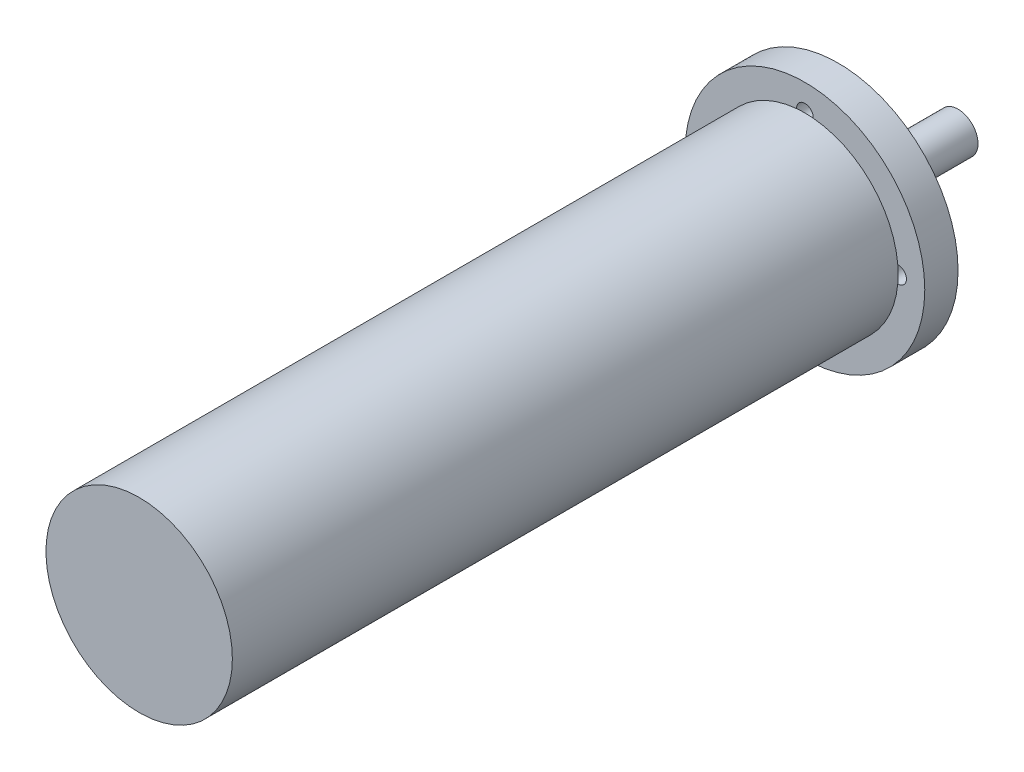
ISO-10303-21;
HEADER;
FILE_DESCRIPTION(('STEP AP214'),'2;1');
FILE_NAME('part.step','',(''),(''),'','','');
FILE_SCHEMA(('AUTOMOTIVE_DESIGN { 1 0 10303 214 1 1 1 1 }'));
ENDSEC;
DATA;
#1=APPLICATION_CONTEXT('core data for automotive mechanical design processes');
#2=APPLICATION_PROTOCOL_DEFINITION('international standard','automotive_design',2000,#1);
#3=PRODUCT_CONTEXT('',#1,'mechanical');
#4=PRODUCT('Part','Part','',(#3));
#5=PRODUCT_RELATED_PRODUCT_CATEGORY('part','',(#4));
#6=PRODUCT_DEFINITION_FORMATION('','',#4);
#7=PRODUCT_DEFINITION_CONTEXT('part definition',#1,'design');
#8=PRODUCT_DEFINITION('design','',#6,#7);
#9=PRODUCT_DEFINITION_SHAPE('','',#8);
#10=(LENGTH_UNIT() NAMED_UNIT(*) SI_UNIT(.MILLI.,.METRE.));
#11=(NAMED_UNIT(*) PLANE_ANGLE_UNIT() SI_UNIT($,.RADIAN.));
#12=(NAMED_UNIT(*) SI_UNIT($,.STERADIAN.) SOLID_ANGLE_UNIT());
#13=UNCERTAINTY_MEASURE_WITH_UNIT(LENGTH_MEASURE(1.E-05),#10,'distance_accuracy_value','');
#14=(GEOMETRIC_REPRESENTATION_CONTEXT(3) GLOBAL_UNCERTAINTY_ASSIGNED_CONTEXT((#13)) GLOBAL_UNIT_ASSIGNED_CONTEXT((#10,
#11,#12)) REPRESENTATION_CONTEXT('',''));
#15=CARTESIAN_POINT('',(0.,0.,0.));
#16=DIRECTION('',(0.,0.,1.));
#17=DIRECTION('',(1.,0.,0.));
#18=AXIS2_PLACEMENT_3D('',#15,#16,#17);
#19=CARTESIAN_POINT('',(0.,0.,-7.));
#20=DIRECTION('',(0.,0.,1.));
#21=DIRECTION('',(1.,0.,0.));
#22=AXIS2_PLACEMENT_3D('',#19,#20,#21);
#23=CYLINDRICAL_SURFACE('',#22,11.);
#24=CARTESIAN_POINT('',(0.,0.,-5.));
#25=DIRECTION('',(0.,0.,-1.));
#26=DIRECTION('',(-1.,0.,0.));
#27=AXIS2_PLACEMENT_3D('',#24,#25,#26);
#28=CIRCLE('',#27,11.);
#29=CARTESIAN_POINT('',(-11.,0.,-5.));
#30=VERTEX_POINT('',#29);
#31=EDGE_CURVE('E180',#30,#30,#28,.T.);
#32=ORIENTED_EDGE('',*,*,#31,.T.);
#33=EDGE_LOOP('',(#32));
#34=FACE_BOUND('',#33,.T.);
#35=CARTESIAN_POINT('',(0.,0.,-7.));
#36=DIRECTION('',(0.,0.,-1.));
#37=DIRECTION('',(-1.,0.,0.));
#38=AXIS2_PLACEMENT_3D('',#35,#36,#37);
#39=CIRCLE('',#38,11.);
#40=CARTESIAN_POINT('',(-11.,0.,-7.));
#41=VERTEX_POINT('',#40);
#42=EDGE_CURVE('E127',#41,#41,#39,.T.);
#43=ORIENTED_EDGE('',*,*,#42,.F.);
#44=EDGE_LOOP('',(#43));
#45=FACE_BOUND('',#44,.T.);
#46=ADVANCED_FACE('F47',(#34,#45),#23,.T.);
#47=CARTESIAN_POINT('',(0.,0.,-7.));
#48=DIRECTION('',(0.,0.,-1.));
#49=DIRECTION('',(-1.,0.,0.));
#50=AXIS2_PLACEMENT_3D('',#47,#48,#49);
#51=PLANE('',#50);
#52=CARTESIAN_POINT('',(0.,0.,-7.));
#53=DIRECTION('',(0.,0.,-1.));
#54=DIRECTION('',(-1.,0.,0.));
#55=AXIS2_PLACEMENT_3D('',#52,#53,#54);
#56=CIRCLE('',#55,3.);
#57=CARTESIAN_POINT('',(-3.,0.,-7.));
#58=VERTEX_POINT('',#57);
#59=EDGE_CURVE('E126',#58,#58,#56,.F.);
#60=ORIENTED_EDGE('',*,*,#59,.T.);
#61=EDGE_LOOP('',(#60));
#62=FACE_BOUND('',#61,.T.);
#63=ORIENTED_EDGE('',*,*,#42,.T.);
#64=EDGE_LOOP('',(#63));
#65=FACE_BOUND('',#64,.T.);
#66=ADVANCED_FACE('F205',(#62,#65),#51,.T.);
#67=CARTESIAN_POINT('',(0.,0.,-23.));
#68=DIRECTION('',(0.,0.,1.));
#69=DIRECTION('',(1.,0.,0.));
#70=AXIS2_PLACEMENT_3D('',#67,#68,#69);
#71=CYLINDRICAL_SURFACE('',#70,3.);
#72=ORIENTED_EDGE('',*,*,#59,.F.);
#73=EDGE_LOOP('',(#72));
#74=FACE_BOUND('',#73,.T.);
#75=CARTESIAN_POINT('',(0.,0.,-23.));
#76=DIRECTION('',(0.,0.,-1.));
#77=DIRECTION('',(-1.,0.,0.));
#78=AXIS2_PLACEMENT_3D('',#75,#76,#77);
#79=CIRCLE('',#78,3.);
#80=CARTESIAN_POINT('',(-3.,0.,-23.));
#81=VERTEX_POINT('',#80);
#82=EDGE_CURVE('E119',#81,#81,#79,.T.);
#83=ORIENTED_EDGE('',*,*,#82,.F.);
#84=EDGE_LOOP('',(#83));
#85=FACE_BOUND('',#84,.T.);
#86=ADVANCED_FACE('F210',(#74,#85),#71,.T.);
#87=CARTESIAN_POINT('',(0.,0.,-23.));
#88=DIRECTION('',(0.,0.,-1.));
#89=DIRECTION('',(-1.,0.,0.));
#90=AXIS2_PLACEMENT_3D('',#87,#88,#89);
#91=PLANE('',#90);
#92=ORIENTED_EDGE('',*,*,#82,.T.);
#93=EDGE_LOOP('',(#92));
#94=FACE_BOUND('',#93,.T.);
#95=ADVANCED_FACE('F234',(#94),#91,.T.);
#96=CARTESIAN_POINT('',(0.,0.,0.));
#97=DIRECTION('',(0.,0.,-1.));
#98=DIRECTION('',(-1.,0.,0.));
#99=AXIS2_PLACEMENT_3D('',#96,#97,#98);
#100=PLANE('',#99);
#101=CARTESIAN_POINT('',(0.,0.,0.));
#102=DIRECTION('',(0.,0.,-1.));
#103=DIRECTION('',(-1.,0.,0.));
#104=AXIS2_PLACEMENT_3D('',#101,#102,#103);
#105=CIRCLE('',#104,18.);
#106=CARTESIAN_POINT('',(-18.,0.,0.));
#107=VERTEX_POINT('',#106);
#108=EDGE_CURVE('E121',#107,#107,#105,.T.);
#109=ORIENTED_EDGE('',*,*,#108,.F.);
#110=EDGE_LOOP('',(#109));
#111=FACE_BOUND('',#110,.T.);
#112=CARTESIAN_POINT('',(0.,0.,0.));
#113=DIRECTION('',(0.,0.,-1.));
#114=DIRECTION('',(-1.,0.,0.));
#115=AXIS2_PLACEMENT_3D('',#112,#113,#114);
#116=CIRCLE('',#115,14.);
#117=CARTESIAN_POINT('',(-13.9441964285714,1.24875376332398,0.));
#118=VERTEX_POINT('',#117);
#119=CARTESIAN_POINT('',(-1.24875376332398,13.9441964285714,0.));
#120=VERTEX_POINT('',#119);
#121=EDGE_CURVE('E103',#118,#120,#116,.T.);
#122=ORIENTED_EDGE('',*,*,#121,.T.);
#123=CARTESIAN_POINT('',(0.,14.,0.));
#124=DIRECTION('',(0.,0.,-1.));
#125=DIRECTION('',(-1.,0.,0.));
#126=AXIS2_PLACEMENT_3D('',#123,#124,#125);
#127=CIRCLE('',#126,1.25);
#128=CARTESIAN_POINT('',(1.24875376332398,13.9441964285714,0.));
#129=VERTEX_POINT('',#128);
#130=EDGE_CURVE('E11',#120,#129,#127,.T.);
#131=ORIENTED_EDGE('',*,*,#130,.T.);
#132=CARTESIAN_POINT('',(13.9441964285714,1.24875376332398,0.));
#133=VERTEX_POINT('',#132);
#134=EDGE_CURVE('E104',#129,#133,#116,.T.);
#135=ORIENTED_EDGE('',*,*,#134,.T.);
#136=CARTESIAN_POINT('',(14.,0.,0.));
#137=DIRECTION('',(0.,0.,-1.));
#138=DIRECTION('',(-1.,0.,0.));
#139=AXIS2_PLACEMENT_3D('',#136,#137,#138);
#140=CIRCLE('',#139,1.25);
#141=CARTESIAN_POINT('',(13.9441964285714,-1.24875376332398,0.));
#142=VERTEX_POINT('',#141);
#143=EDGE_CURVE('E135',#133,#142,#140,.T.);
#144=ORIENTED_EDGE('',*,*,#143,.T.);
#145=CARTESIAN_POINT('',(1.24875376332398,-13.9441964285714,0.));
#146=VERTEX_POINT('',#145);
#147=EDGE_CURVE('E120',#142,#146,#116,.T.);
#148=ORIENTED_EDGE('',*,*,#147,.T.);
#149=CARTESIAN_POINT('',(0.,-14.,0.));
#150=DIRECTION('',(0.,0.,-1.));
#151=DIRECTION('',(-1.,0.,0.));
#152=AXIS2_PLACEMENT_3D('',#149,#150,#151);
#153=CIRCLE('',#152,1.25);
#154=CARTESIAN_POINT('',(-1.24875376332398,-13.9441964285714,0.));
#155=VERTEX_POINT('',#154);
#156=EDGE_CURVE('E142',#146,#155,#153,.T.);
#157=ORIENTED_EDGE('',*,*,#156,.T.);
#158=CARTESIAN_POINT('',(-13.9441964285714,-1.24875376332398,0.));
#159=VERTEX_POINT('',#158);
#160=EDGE_CURVE('E113',#155,#159,#116,.T.);
#161=ORIENTED_EDGE('',*,*,#160,.T.);
#162=CARTESIAN_POINT('',(-14.,0.,0.));
#163=DIRECTION('',(0.,0.,-1.));
#164=DIRECTION('',(-1.,0.,0.));
#165=AXIS2_PLACEMENT_3D('',#162,#163,#164);
#166=CIRCLE('',#165,1.25);
#167=EDGE_CURVE('E56',#159,#118,#166,.T.);
#168=ORIENTED_EDGE('',*,*,#167,.T.);
#169=EDGE_LOOP('',(#122,#131,#135,#144,#148,#157,#161,#168));
#170=FACE_BOUND('',#169,.T.);
#171=ADVANCED_FACE('F108',(#111,#170),#100,.F.);
#172=CARTESIAN_POINT('',(0.,0.,-5.));
#173=DIRECTION('',(0.,0.,1.));
#174=DIRECTION('',(1.,0.,0.));
#175=AXIS2_PLACEMENT_3D('',#172,#173,#174);
#176=CYLINDRICAL_SURFACE('',#175,18.);
#177=CARTESIAN_POINT('',(0.,0.,-5.));
#178=DIRECTION('',(0.,0.,-1.));
#179=DIRECTION('',(-1.,0.,0.));
#180=AXIS2_PLACEMENT_3D('',#177,#178,#179);
#181=CIRCLE('',#180,18.);
#182=CARTESIAN_POINT('',(-18.,0.,-5.));
#183=VERTEX_POINT('',#182);
#184=EDGE_CURVE('E177',#183,#183,#181,.T.);
#185=ORIENTED_EDGE('',*,*,#184,.F.);
#186=EDGE_LOOP('',(#185));
#187=FACE_BOUND('',#186,.T.);
#188=ORIENTED_EDGE('',*,*,#108,.T.);
#189=EDGE_LOOP('',(#188));
#190=FACE_BOUND('',#189,.T.);
#191=ADVANCED_FACE('F221',(#187,#190),#176,.T.);
#192=CARTESIAN_POINT('',(0.,0.,-5.));
#193=DIRECTION('',(0.,0.,-1.));
#194=DIRECTION('',(-1.,0.,0.));
#195=AXIS2_PLACEMENT_3D('',#192,#193,#194);
#196=PLANE('',#195);
#197=CARTESIAN_POINT('',(0.,14.,-5.));
#198=DIRECTION('',(0.,0.,-1.));
#199=DIRECTION('',(-1.,0.,0.));
#200=AXIS2_PLACEMENT_3D('',#197,#198,#199);
#201=CIRCLE('',#200,1.25);
#202=CARTESIAN_POINT('',(-1.25,14.,-5.));
#203=VERTEX_POINT('',#202);
#204=EDGE_CURVE('E97',#203,#203,#201,.T.);
#205=ORIENTED_EDGE('',*,*,#204,.F.);
#206=EDGE_LOOP('',(#205));
#207=FACE_BOUND('',#206,.T.);
#208=CARTESIAN_POINT('',(-14.,0.,-5.));
#209=DIRECTION('',(0.,0.,-1.));
#210=DIRECTION('',(-1.,0.,0.));
#211=AXIS2_PLACEMENT_3D('',#208,#209,#210);
#212=CIRCLE('',#211,1.25);
#213=CARTESIAN_POINT('',(-15.25,0.,-5.));
#214=VERTEX_POINT('',#213);
#215=EDGE_CURVE('E96',#214,#214,#212,.T.);
#216=ORIENTED_EDGE('',*,*,#215,.F.);
#217=EDGE_LOOP('',(#216));
#218=FACE_BOUND('',#217,.T.);
#219=CARTESIAN_POINT('',(0.,-14.,-5.));
#220=DIRECTION('',(0.,0.,-1.));
#221=DIRECTION('',(-1.,0.,0.));
#222=AXIS2_PLACEMENT_3D('',#219,#220,#221);
#223=CIRCLE('',#222,1.25);
#224=CARTESIAN_POINT('',(-1.25,-14.,-5.));
#225=VERTEX_POINT('',#224);
#226=EDGE_CURVE('E158',#225,#225,#223,.T.);
#227=ORIENTED_EDGE('',*,*,#226,.F.);
#228=EDGE_LOOP('',(#227));
#229=FACE_BOUND('',#228,.T.);
#230=CARTESIAN_POINT('',(14.,0.,-5.));
#231=DIRECTION('',(0.,0.,-1.));
#232=DIRECTION('',(-1.,0.,0.));
#233=AXIS2_PLACEMENT_3D('',#230,#231,#232);
#234=CIRCLE('',#233,1.25);
#235=CARTESIAN_POINT('',(12.75,0.,-5.));
#236=VERTEX_POINT('',#235);
#237=EDGE_CURVE('E170',#236,#236,#234,.T.);
#238=ORIENTED_EDGE('',*,*,#237,.F.);
#239=EDGE_LOOP('',(#238));
#240=FACE_BOUND('',#239,.T.);
#241=ORIENTED_EDGE('',*,*,#184,.T.);
#242=EDGE_LOOP('',(#241));
#243=FACE_BOUND('',#242,.T.);
#244=ORIENTED_EDGE('',*,*,#31,.F.);
#245=EDGE_LOOP('',(#244));
#246=FACE_BOUND('',#245,.T.);
#247=ADVANCED_FACE('F216',(#207,#218,#229,#240,#243,#246),#196,.T.);
#248=CARTESIAN_POINT('',(0.,0.,100.));
#249=DIRECTION('',(0.,0.,1.));
#250=DIRECTION('',(1.,0.,0.));
#251=AXIS2_PLACEMENT_3D('',#248,#249,#250);
#252=PLANE('',#251);
#253=CARTESIAN_POINT('',(0.,0.,100.));
#254=DIRECTION('',(0.,0.,1.));
#255=DIRECTION('',(1.,0.,0.));
#256=AXIS2_PLACEMENT_3D('',#253,#254,#255);
#257=CIRCLE('',#256,14.);
#258=CARTESIAN_POINT('',(14.,0.,100.));
#259=VERTEX_POINT('',#258);
#260=EDGE_CURVE('E131',#259,#259,#257,.T.);
#261=ORIENTED_EDGE('',*,*,#260,.T.);
#262=EDGE_LOOP('',(#261));
#263=FACE_BOUND('',#262,.T.);
#264=ADVANCED_FACE('F201',(#263),#252,.T.);
#265=CARTESIAN_POINT('',(0.,0.,100.));
#266=DIRECTION('',(0.,0.,-1.));
#267=DIRECTION('',(-1.,0.,0.));
#268=AXIS2_PLACEMENT_3D('',#265,#266,#267);
#269=CYLINDRICAL_SURFACE('',#268,14.);
#270=ORIENTED_EDGE('',*,*,#260,.F.);
#271=EDGE_LOOP('',(#270));
#272=FACE_BOUND('',#271,.T.);
#273=EDGE_CURVE('E114',#133,#142,#116,.T.);
#274=ORIENTED_EDGE('',*,*,#273,.F.);
#275=ORIENTED_EDGE('',*,*,#134,.F.);
#276=EDGE_CURVE('E94',#120,#129,#116,.T.);
#277=ORIENTED_EDGE('',*,*,#276,.F.);
#278=ORIENTED_EDGE('',*,*,#121,.F.);
#279=EDGE_CURVE('E111',#159,#118,#116,.T.);
#280=ORIENTED_EDGE('',*,*,#279,.F.);
#281=ORIENTED_EDGE('',*,*,#160,.F.);
#282=EDGE_CURVE('E149',#146,#155,#116,.T.);
#283=ORIENTED_EDGE('',*,*,#282,.F.);
#284=ORIENTED_EDGE('',*,*,#147,.F.);
#285=EDGE_LOOP('',(#274,#275,#277,#278,#280,#281,#283,#284));
#286=FACE_BOUND('',#285,.T.);
#287=ADVANCED_FACE('F49',(#272,#286),#269,.T.);
#288=CARTESIAN_POINT('',(0.,0.,0.));
#289=DIRECTION('',(0.,0.,-1.));
#290=DIRECTION('',(-1.,0.,0.));
#291=AXIS2_PLACEMENT_3D('',#288,#289,#290);
#292=PLANE('',#291);
#293=ORIENTED_EDGE('',*,*,#273,.T.);
#294=CARTESIAN_POINT('',(14.,0.,0.));
#295=DIRECTION('',(0.,0.,-1.));
#296=DIRECTION('',(-1.,0.,0.));
#297=AXIS2_PLACEMENT_3D('',#294,#295,#296);
#298=CIRCLE('',#297,1.25);
#299=EDGE_CURVE('E174',#133,#142,#298,.F.);
#300=ORIENTED_EDGE('',*,*,#299,.F.);
#301=EDGE_LOOP('',(#293,#300));
#302=FACE_BOUND('',#301,.T.);
#303=ADVANCED_FACE('F192',(#302),#292,.T.);
#304=CARTESIAN_POINT('',(14.,0.,-5.));
#305=DIRECTION('',(0.,0.,-1.));
#306=DIRECTION('',(-1.,0.,0.));
#307=AXIS2_PLACEMENT_3D('',#304,#305,#306);
#308=CYLINDRICAL_SURFACE('',#307,1.25);
#309=ORIENTED_EDGE('',*,*,#299,.T.);
#310=ORIENTED_EDGE('',*,*,#143,.F.);
#311=EDGE_LOOP('',(#309,#310));
#312=FACE_BOUND('',#311,.T.);
#313=ORIENTED_EDGE('',*,*,#237,.T.);
#314=EDGE_LOOP('',(#313));
#315=FACE_BOUND('',#314,.T.);
#316=ADVANCED_FACE('F189',(#312,#315),#308,.F.);
#317=CARTESIAN_POINT('',(0.,0.,0.));
#318=DIRECTION('',(0.,0.,-1.));
#319=DIRECTION('',(-1.,0.,0.));
#320=AXIS2_PLACEMENT_3D('',#317,#318,#319);
#321=PLANE('',#320);
#322=ORIENTED_EDGE('',*,*,#282,.T.);
#323=CARTESIAN_POINT('',(0.,-14.,0.));
#324=DIRECTION('',(0.,0.,-1.));
#325=DIRECTION('',(-1.,0.,0.));
#326=AXIS2_PLACEMENT_3D('',#323,#324,#325);
#327=CIRCLE('',#326,1.25);
#328=EDGE_CURVE('E163',#146,#155,#327,.F.);
#329=ORIENTED_EDGE('',*,*,#328,.F.);
#330=EDGE_LOOP('',(#322,#329));
#331=FACE_BOUND('',#330,.T.);
#332=ADVANCED_FACE('F199',(#331),#321,.T.);
#333=CARTESIAN_POINT('',(0.,-14.,-5.));
#334=DIRECTION('',(0.,0.,-1.));
#335=DIRECTION('',(-1.,0.,0.));
#336=AXIS2_PLACEMENT_3D('',#333,#334,#335);
#337=CYLINDRICAL_SURFACE('',#336,1.25);
#338=ORIENTED_EDGE('',*,*,#328,.T.);
#339=ORIENTED_EDGE('',*,*,#156,.F.);
#340=EDGE_LOOP('',(#338,#339));
#341=FACE_BOUND('',#340,.T.);
#342=ORIENTED_EDGE('',*,*,#226,.T.);
#343=EDGE_LOOP('',(#342));
#344=FACE_BOUND('',#343,.T.);
#345=ADVANCED_FACE('F322',(#341,#344),#337,.F.);
#346=CARTESIAN_POINT('',(0.,0.,0.));
#347=DIRECTION('',(0.,0.,-1.));
#348=DIRECTION('',(-1.,0.,0.));
#349=AXIS2_PLACEMENT_3D('',#346,#347,#348);
#350=PLANE('',#349);
#351=ORIENTED_EDGE('',*,*,#279,.T.);
#352=CARTESIAN_POINT('',(-14.,0.,0.));
#353=DIRECTION('',(0.,0.,-1.));
#354=DIRECTION('',(-1.,0.,0.));
#355=AXIS2_PLACEMENT_3D('',#352,#353,#354);
#356=CIRCLE('',#355,1.25);
#357=EDGE_CURVE('E69',#159,#118,#356,.F.);
#358=ORIENTED_EDGE('',*,*,#357,.F.);
#359=EDGE_LOOP('',(#351,#358));
#360=FACE_BOUND('',#359,.T.);
#361=ADVANCED_FACE('F156',(#360),#350,.T.);
#362=CARTESIAN_POINT('',(-14.,0.,-5.));
#363=DIRECTION('',(0.,0.,-1.));
#364=DIRECTION('',(-1.,0.,0.));
#365=AXIS2_PLACEMENT_3D('',#362,#363,#364);
#366=CYLINDRICAL_SURFACE('',#365,1.25);
#367=ORIENTED_EDGE('',*,*,#357,.T.);
#368=ORIENTED_EDGE('',*,*,#167,.F.);
#369=EDGE_LOOP('',(#367,#368));
#370=FACE_BOUND('',#369,.T.);
#371=ORIENTED_EDGE('',*,*,#215,.T.);
#372=EDGE_LOOP('',(#371));
#373=FACE_BOUND('',#372,.T.);
#374=ADVANCED_FACE('F340',(#370,#373),#366,.F.);
#375=CARTESIAN_POINT('',(0.,0.,0.));
#376=DIRECTION('',(0.,0.,-1.));
#377=DIRECTION('',(-1.,0.,0.));
#378=AXIS2_PLACEMENT_3D('',#375,#376,#377);
#379=PLANE('',#378);
#380=ORIENTED_EDGE('',*,*,#276,.T.);
#381=CARTESIAN_POINT('',(0.,14.,0.));
#382=DIRECTION('',(0.,0.,-1.));
#383=DIRECTION('',(-1.,0.,0.));
#384=AXIS2_PLACEMENT_3D('',#381,#382,#383);
#385=CIRCLE('',#384,1.25);
#386=EDGE_CURVE('E62',#120,#129,#385,.F.);
#387=ORIENTED_EDGE('',*,*,#386,.F.);
#388=EDGE_LOOP('',(#380,#387));
#389=FACE_BOUND('',#388,.T.);
#390=ADVANCED_FACE('F93',(#389),#379,.T.);
#391=CARTESIAN_POINT('',(0.,14.,-5.));
#392=DIRECTION('',(0.,0.,-1.));
#393=DIRECTION('',(-1.,0.,0.));
#394=AXIS2_PLACEMENT_3D('',#391,#392,#393);
#395=CYLINDRICAL_SURFACE('',#394,1.25);
#396=ORIENTED_EDGE('',*,*,#386,.T.);
#397=ORIENTED_EDGE('',*,*,#130,.F.);
#398=EDGE_LOOP('',(#396,#397));
#399=FACE_BOUND('',#398,.T.);
#400=ORIENTED_EDGE('',*,*,#204,.T.);
#401=EDGE_LOOP('',(#400));
#402=FACE_BOUND('',#401,.T.);
#403=ADVANCED_FACE('F86',(#399,#402),#395,.F.);
#404=CLOSED_SHELL('',(#46,#66,#86,#95,#171,#191,#247,#264,#287,#303,#316,#332,#345,#361,#374,
#390,#403));
#405=MANIFOLD_SOLID_BREP('B2',#404);
#406=ADVANCED_BREP_SHAPE_REPRESENTATION('',(#18,#405),#14);
#407=SHAPE_DEFINITION_REPRESENTATION(#9,#406);
ENDSEC;
END-ISO-10303-21;
